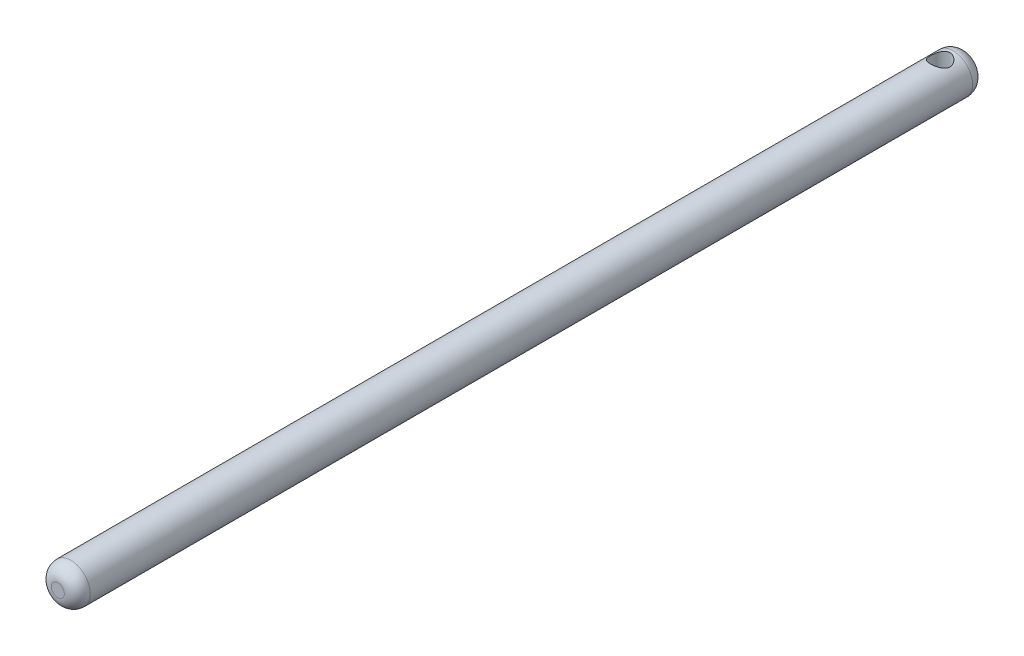
ISO-10303-21;
HEADER;
FILE_DESCRIPTION(('STEP AP214'),'2;1');
FILE_NAME('part.step','',(''),(''),'','','');
FILE_SCHEMA(('AUTOMOTIVE_DESIGN { 1 0 10303 214 1 1 1 1 }'));
ENDSEC;
DATA;
#1=APPLICATION_CONTEXT('core data for automotive mechanical design processes');
#2=APPLICATION_PROTOCOL_DEFINITION('international standard','automotive_design',2000,#1);
#3=PRODUCT_CONTEXT('',#1,'mechanical');
#4=PRODUCT('Part','Part','',(#3));
#5=PRODUCT_RELATED_PRODUCT_CATEGORY('part','',(#4));
#6=PRODUCT_DEFINITION_FORMATION('','',#4);
#7=PRODUCT_DEFINITION_CONTEXT('part definition',#1,'design');
#8=PRODUCT_DEFINITION('design','',#6,#7);
#9=PRODUCT_DEFINITION_SHAPE('','',#8);
#10=(LENGTH_UNIT() NAMED_UNIT(*) SI_UNIT(.MILLI.,.METRE.));
#11=(NAMED_UNIT(*) PLANE_ANGLE_UNIT() SI_UNIT($,.RADIAN.));
#12=(NAMED_UNIT(*) SI_UNIT($,.STERADIAN.) SOLID_ANGLE_UNIT());
#13=UNCERTAINTY_MEASURE_WITH_UNIT(LENGTH_MEASURE(1.E-05),#10,'distance_accuracy_value','');
#14=(GEOMETRIC_REPRESENTATION_CONTEXT(3) GLOBAL_UNCERTAINTY_ASSIGNED_CONTEXT((#13)) GLOBAL_UNIT_ASSIGNED_CONTEXT((#10,
#11,#12)) REPRESENTATION_CONTEXT('',''));
#15=CARTESIAN_POINT('',(0.,0.,0.));
#16=DIRECTION('',(0.,0.,1.));
#17=DIRECTION('',(1.,0.,0.));
#18=AXIS2_PLACEMENT_3D('',#15,#16,#17);
#19=CARTESIAN_POINT('',(0.,0.,55.5625));
#20=DIRECTION('',(0.,0.,-1.));
#21=DIRECTION('',(-1.,0.,0.));
#22=AXIS2_PLACEMENT_3D('',#19,#20,#21);
#23=CYLINDRICAL_SURFACE('',#22,2.38125);
#24=CARTESIAN_POINT('',(0.,0.,-53.975));
#25=DIRECTION('',(0.,0.,1.));
#26=DIRECTION('',(1.,0.,0.));
#27=AXIS2_PLACEMENT_3D('',#24,#25,#26);
#28=CIRCLE('',#27,2.38125);
#29=CARTESIAN_POINT('',(2.38125,0.,-53.975));
#30=VERTEX_POINT('',#29);
#31=EDGE_CURVE('E44',#30,#30,#28,.T.);
#32=ORIENTED_EDGE('',*,*,#31,.T.);
#33=EDGE_LOOP('',(#32));
#34=FACE_BOUND('',#33,.T.);
#35=CARTESIAN_POINT('',(0.,-2.38125,-51.196875));
#36=CARTESIAN_POINT('',(0.0625934933908994,-2.38124658771817,-51.1968789318242));
#37=CARTESIAN_POINT('',(0.125261607765469,-2.37875553370113,-51.2018399933105));
#38=CARTESIAN_POINT('',(0.248745655116467,-2.36903604532025,-51.2214648356559));
#39=CARTESIAN_POINT('',(0.309557840743264,-2.36179861446384,-51.2361470429128));
#40=CARTESIAN_POINT('',(0.427355251873432,-2.34334382664568,-51.2744963783844));
#41=CARTESIAN_POINT('',(0.484354349749458,-2.33214194770735,-51.2981285887453));
#42=CARTESIAN_POINT('',(0.593493959385313,-2.30678565164099,-51.3535262710626));
#43=CARTESIAN_POINT('',(0.6456348537819,-2.29263146732422,-51.3852911017463));
#44=CARTESIAN_POINT('',(0.747126495522779,-2.26166669988499,-51.4582377251684));
#45=CARTESIAN_POINT('',(0.796117610742257,-2.24474721461223,-51.4998729643447));
#46=CARTESIAN_POINT('',(0.886753026544736,-2.2105140207503,-51.5904021362285));
#47=CARTESIAN_POINT('',(0.928391728636486,-2.19320002298883,-51.6393015485166));
#48=CARTESIAN_POINT('',(1.00637816303611,-2.15859063769342,-51.7475192380263));
#49=CARTESIAN_POINT('',(1.04206516514116,-2.14140081986313,-51.8073514170931));
#50=CARTESIAN_POINT('',(1.10271904514173,-2.11081118475794,-51.9331186094086));
#51=CARTESIAN_POINT('',(1.12769358094428,-2.09740866244572,-51.9990492220105));
#52=CARTESIAN_POINT('',(1.16458893898078,-2.07713897941891,-52.131116891143));
#53=CARTESIAN_POINT('',(1.17720172358639,-2.06992860854359,-52.1970053007427));
#54=CARTESIAN_POINT('',(1.19113338890834,-2.06194687719966,-52.3303248037312));
#55=CARTESIAN_POINT('',(1.19246343021918,-2.06116915374353,-52.3977543064747));
#56=CARTESIAN_POINT('',(1.18429955128951,-2.06586451337537,-52.5235717977005));
#57=CARTESIAN_POINT('',(1.17608099119852,-2.07060121735085,-52.5820767371749));
#58=CARTESIAN_POINT('',(1.1512627577834,-2.08450134836241,-52.6967313983473));
#59=CARTESIAN_POINT('',(1.13466041470314,-2.09366618546584,-52.7528803636291));
#60=CARTESIAN_POINT('',(1.09324351977208,-2.1155915160392,-52.862832185961));
#61=CARTESIAN_POINT('',(1.06824668928498,-2.12843079040573,-52.9165499310543));
#62=CARTESIAN_POINT('',(1.01089025937971,-2.15626240722546,-53.019286454615));
#63=CARTESIAN_POINT('',(0.978527352789217,-2.17125571566414,-53.0683031083238));
#64=CARTESIAN_POINT('',(0.902572396630538,-2.204003536286,-53.1667893665474));
#65=CARTESIAN_POINT('',(0.858076839495926,-2.22186710625626,-53.2155283401016));
#66=CARTESIAN_POINT('',(0.761470860938948,-2.25680138992047,-53.3051568577598));
#67=CARTESIAN_POINT('',(0.709356821108757,-2.27387172175947,-53.3460426505153));
#68=CARTESIAN_POINT('',(0.595927464756042,-2.30626428608779,-53.4205882401635));
#69=CARTESIAN_POINT('',(0.534297244998043,-2.3214685301789,-53.4538243125057));
#70=CARTESIAN_POINT('',(0.405367587816347,-2.34741102209979,-53.5091842752043));
#71=CARTESIAN_POINT('',(0.338072701740843,-2.35815281492167,-53.5313169890337));
#72=CARTESIAN_POINT('',(0.205700104133522,-2.37320534860897,-53.5620222775502));
#73=CARTESIAN_POINT('',(0.140900384809098,-2.37797504664999,-53.571566127561));
#74=CARTESIAN_POINT('',(0.0104532111896987,-2.38211931649743,-53.579868945507));
#75=CARTESIAN_POINT('',(-0.0551938267826014,-2.38149644415062,-53.5786330225895));
#76=CARTESIAN_POINT('',(-0.180061757270823,-2.37519200776753,-53.5659726616014));
#77=CARTESIAN_POINT('',(-0.239386357709476,-2.36990626897501,-53.5553453282183));
#78=CARTESIAN_POINT('',(-0.355290706146968,-2.35532022721706,-53.5254540456499));
#79=CARTESIAN_POINT('',(-0.41187015077584,-2.34601948166815,-53.5061891443165));
#80=CARTESIAN_POINT('',(-0.522551749435379,-2.323912493394,-53.459064325903));
#81=CARTESIAN_POINT('',(-0.576536816435449,-2.31101362357334,-53.4309744059547));
#82=CARTESIAN_POINT('',(-0.679205558772774,-2.28295169421308,-53.3672563403714));
#83=CARTESIAN_POINT('',(-0.72788696232619,-2.26778767095513,-53.3316249834997));
#84=CARTESIAN_POINT('',(-0.823635905061679,-2.23490101029919,-53.249797743588));
#85=CARTESIAN_POINT('',(-0.870075505159957,-2.21707334772676,-53.2029080222475));
#86=CARTESIAN_POINT('',(-0.954710182325446,-2.18196785003363,-53.10196411677));
#87=CARTESIAN_POINT('',(-0.992899556088152,-2.1646904022613,-53.0479050179093));
#88=CARTESIAN_POINT('',(-1.06168973569881,-2.13182825744163,-52.9308492742177));
#89=CARTESIAN_POINT('',(-1.0918334810305,-2.11636605630572,-52.8675465861704));
#90=CARTESIAN_POINT('',(-1.14071736472268,-2.09042879913301,-52.7357458256536));
#91=CARTESIAN_POINT('',(-1.15947219672863,-2.07994732092736,-52.6672545762595));
#92=CARTESIAN_POINT('',(-1.18331657161977,-2.06646662138444,-52.5340537659056));
#93=CARTESIAN_POINT('',(-1.18954509883977,-2.06284572182648,-52.469612342011));
#94=CARTESIAN_POINT('',(-1.19144552443462,-2.06175000375602,-52.3405333356499));
#95=CARTESIAN_POINT('',(-1.18712199863717,-2.06427252119055,-52.2758958503446));
#96=CARTESIAN_POINT('',(-1.16910579328328,-2.07451954503311,-52.1547524559884));
#97=CARTESIAN_POINT('',(-1.15634489926439,-2.081725593681,-52.0980585027343));
#98=CARTESIAN_POINT('',(-1.12296816088621,-2.0999174114874,-51.98767845781));
#99=CARTESIAN_POINT('',(-1.10234978978714,-2.11090439637645,-51.9339933400718));
#100=CARTESIAN_POINT('',(-1.05229312174862,-2.13632093965267,-51.8271622867941));
#101=CARTESIAN_POINT('',(-1.02235532346271,-2.15093219477965,-51.774294904384));
#102=CARTESIAN_POINT('',(-0.95506100060486,-2.18164566727434,-51.67398875536));
#103=CARTESIAN_POINT('',(-0.917700616381009,-2.19774865799103,-51.6265528333514));
#104=CARTESIAN_POINT('',(-0.831298335810082,-2.23197328511557,-51.5324622022555));
#105=CARTESIAN_POINT('',(-0.781388641146478,-2.25010245755217,-51.4866027562503));
#106=CARTESIAN_POINT('',(-0.674078066156012,-2.28454448778714,-51.4037306353612));
#107=CARTESIAN_POINT('',(-0.6166731736276,-2.30085636405198,-51.3667227289956));
#108=CARTESIAN_POINT('',(-0.495218557463739,-2.33002942662264,-51.3025592055863));
#109=CARTESIAN_POINT('',(-0.431124721872141,-2.34286539970214,-51.2754750982945));
#110=CARTESIAN_POINT('',(-0.298539814353391,-2.36340659560876,-51.2328221500715));
#111=CARTESIAN_POINT('',(-0.230061848926329,-2.37112639390897,-51.2172205823685));
#112=CARTESIAN_POINT('',(-0.134066692531778,-2.37762409336193,-51.2041408949378));
#113=CARTESIAN_POINT('',(-0.107348987707652,-2.37898025606987,-51.2014200432218));
#114=CARTESIAN_POINT('',(-0.0537587806828962,-2.3807939546427,-51.1977862263691));
#115=CARTESIAN_POINT('',(-0.0268862742301627,-2.38125146570418,-51.1968733111327));
#116=CARTESIAN_POINT('',(0.,-2.38125,-51.196875));
#117=B_SPLINE_CURVE_WITH_KNOTS('',3,(#35,#36,#37,#38,#39,#40,#41,#42,#43,#44,#45,#46,#47,#48,
#49,#50,#51,#52,#53,#54,#55,#56,#57,#58,#59,#60,#61,#62,#63,#64,#65,#66,#67,#68,#69,#70,#71,#72,
#73,#74,#75,#76,#77,#78,#79,#80,#81,#82,#83,#84,#85,#86,#87,#88,#89,#90,#91,#92,#93,#94,#95,#96,
#97,#98,#99,#100,#101,#102,#103,#104,#105,#106,#107,#108,#109,#110,#111,#112,#113,#114,#115,
#116),.UNSPECIFIED.,.T.,.F.,(4,2,2,2,2,2,2,2,2,2,2,2,2,2,2,2,2,2,2,2,2,2,2,2,2,2,2,2,2,2,2,2,2,
2,2,2,2,2,2,2,4),(0.,0.187671381491034,0.37569951574751,0.563001503883015,0.750288727442423,
0.948906406473715,1.14767467670682,1.36185743031614,1.5758868171639,1.7771032070446,
1.97812053569864,2.15509926337345,2.33213438424009,2.51329317200603,2.69453345625449,
2.89875445775647,3.10307277131559,3.31687910824066,3.53051527011181,3.72645730217444,
3.92230647121474,4.10297598058849,4.28366541066825,4.46952119208214,4.65545627297239,
4.85965036423508,5.06398516445245,5.27821543446359,5.49216872029484,5.68558331740248,
5.87891405645815,6.05382723196975,6.22879670208062,6.41552156348462,6.60234377481067,
6.81186617152189,7.02150118957728,7.23261841267416,7.44313156831553,7.52374130413941,
7.60435326481735),.UNSPECIFIED.);
#118=CARTESIAN_POINT('',(0.,-2.38125,-51.196875));
#119=VERTEX_POINT('',#118);
#120=EDGE_CURVE('E48',#119,#119,#117,.T.);
#121=ORIENTED_EDGE('',*,*,#120,.T.);
#122=EDGE_LOOP('',(#121));
#123=FACE_BOUND('',#122,.T.);
#124=CARTESIAN_POINT('',(0.,2.38125,-51.196875));
#125=CARTESIAN_POINT('',(-0.0625934933908988,2.38124658771817,-51.1968789318242));
#126=CARTESIAN_POINT('',(-0.125261607765469,2.37875553370113,-51.2018399933105));
#127=CARTESIAN_POINT('',(-0.248745655116467,2.36903604532025,-51.2214648356559));
#128=CARTESIAN_POINT('',(-0.309557840743263,2.36179861446383,-51.2361470429128));
#129=CARTESIAN_POINT('',(-0.427355251873431,2.34334382664568,-51.2744963783844));
#130=CARTESIAN_POINT('',(-0.484354349749458,2.33214194770735,-51.2981285887453));
#131=CARTESIAN_POINT('',(-0.593493959385312,2.30678565164099,-51.3535262710626));
#132=CARTESIAN_POINT('',(-0.645634853781898,2.29263146732422,-51.3852911017463));
#133=CARTESIAN_POINT('',(-0.747126495522779,2.26166669988499,-51.4582377251684));
#134=CARTESIAN_POINT('',(-0.796117610742258,2.24474721461223,-51.4998729643447));
#135=CARTESIAN_POINT('',(-0.886753026544737,2.2105140207503,-51.5904021362285));
#136=CARTESIAN_POINT('',(-0.928391728636486,2.19320002298883,-51.6393015485166));
#137=CARTESIAN_POINT('',(-1.0063781630361,2.15859063769342,-51.7475192380263));
#138=CARTESIAN_POINT('',(-1.04206516514116,2.14140081986313,-51.8073514170931));
#139=CARTESIAN_POINT('',(-1.10271904514173,2.11081118475795,-51.9331186094086));
#140=CARTESIAN_POINT('',(-1.12769358094428,2.09740866244572,-51.9990492220105));
#141=CARTESIAN_POINT('',(-1.16458893898078,2.07713897941891,-52.131116891143));
#142=CARTESIAN_POINT('',(-1.17720172358639,2.06992860854359,-52.1970053007427));
#143=CARTESIAN_POINT('',(-1.19113338890834,2.06194687719966,-52.3303248037312));
#144=CARTESIAN_POINT('',(-1.19246343021918,2.06116915374353,-52.3977543064747));
#145=CARTESIAN_POINT('',(-1.18429955128951,2.06586451337537,-52.5235717977005));
#146=CARTESIAN_POINT('',(-1.17608099119852,2.07060121735085,-52.5820767371749));
#147=CARTESIAN_POINT('',(-1.1512627577834,2.08450134836241,-52.6967313983473));
#148=CARTESIAN_POINT('',(-1.13466041470314,2.09366618546584,-52.7528803636291));
#149=CARTESIAN_POINT('',(-1.09324351977208,2.1155915160392,-52.862832185961));
#150=CARTESIAN_POINT('',(-1.06824668928498,2.12843079040573,-52.9165499310543));
#151=CARTESIAN_POINT('',(-1.01089025937971,2.15626240722546,-53.019286454615));
#152=CARTESIAN_POINT('',(-0.978527352789213,2.17125571566415,-53.0683031083238));
#153=CARTESIAN_POINT('',(-0.902572396630532,2.204003536286,-53.1667893665474));
#154=CARTESIAN_POINT('',(-0.858076839495922,2.22186710625626,-53.2155283401016));
#155=CARTESIAN_POINT('',(-0.761470860938945,2.25680138992047,-53.3051568577598));
#156=CARTESIAN_POINT('',(-0.709356821108756,2.27387172175947,-53.3460426505153));
#157=CARTESIAN_POINT('',(-0.595927464756041,2.30626428608779,-53.4205882401635));
#158=CARTESIAN_POINT('',(-0.534297244998042,2.3214685301789,-53.4538243125057));
#159=CARTESIAN_POINT('',(-0.405367587816345,2.34741102209979,-53.5091842752043));
#160=CARTESIAN_POINT('',(-0.338072701740842,2.35815281492167,-53.5313169890337));
#161=CARTESIAN_POINT('',(-0.205700104133521,2.37320534860897,-53.5620222775502));
#162=CARTESIAN_POINT('',(-0.140900384809097,2.37797504664999,-53.571566127561));
#163=CARTESIAN_POINT('',(-0.0104532111896979,2.38211931649743,-53.579868945507));
#164=CARTESIAN_POINT('',(0.0551938267826021,2.38149644415062,-53.5786330225895));
#165=CARTESIAN_POINT('',(0.180061757270824,2.37519200776753,-53.5659726616014));
#166=CARTESIAN_POINT('',(0.239386357709476,2.36990626897501,-53.5553453282183));
#167=CARTESIAN_POINT('',(0.355290706146968,2.35532022721706,-53.5254540456499));
#168=CARTESIAN_POINT('',(0.411870150775841,2.34601948166815,-53.5061891443165));
#169=CARTESIAN_POINT('',(0.52255174943538,2.323912493394,-53.459064325903));
#170=CARTESIAN_POINT('',(0.576536816435449,2.31101362357334,-53.4309744059547));
#171=CARTESIAN_POINT('',(0.679205558772775,2.28295169421308,-53.3672563403714));
#172=CARTESIAN_POINT('',(0.727886962326192,2.26778767095513,-53.3316249834997));
#173=CARTESIAN_POINT('',(0.823635905061678,2.23490101029919,-53.249797743588));
#174=CARTESIAN_POINT('',(0.870075505159953,2.21707334772676,-53.2029080222475));
#175=CARTESIAN_POINT('',(0.954710182325443,2.18196785003363,-53.10196411677));
#176=CARTESIAN_POINT('',(0.992899556088151,2.1646904022613,-53.0479050179093));
#177=CARTESIAN_POINT('',(1.06168973569881,2.13182825744163,-52.9308492742177));
#178=CARTESIAN_POINT('',(1.0918334810305,2.11636605630572,-52.8675465861704));
#179=CARTESIAN_POINT('',(1.14071736472268,2.09042879913301,-52.7357458256536));
#180=CARTESIAN_POINT('',(1.15947219672863,2.07994732092736,-52.6672545762595));
#181=CARTESIAN_POINT('',(1.18331657161977,2.06646662138444,-52.5340537659056));
#182=CARTESIAN_POINT('',(1.18954509883977,2.06284572182648,-52.469612342011));
#183=CARTESIAN_POINT('',(1.19144552443462,2.06175000375602,-52.3405333356499));
#184=CARTESIAN_POINT('',(1.18712199863717,2.06427252119055,-52.2758958503446));
#185=CARTESIAN_POINT('',(1.16910579328328,2.07451954503311,-52.1547524559884));
#186=CARTESIAN_POINT('',(1.15634489926439,2.081725593681,-52.0980585027343));
#187=CARTESIAN_POINT('',(1.12296816088621,2.09991741148739,-51.98767845781));
#188=CARTESIAN_POINT('',(1.10234978978715,2.11090439637645,-51.9339933400718));
#189=CARTESIAN_POINT('',(1.05229312174862,2.13632093965266,-51.8271622867941));
#190=CARTESIAN_POINT('',(1.02235532346271,2.15093219477965,-51.774294904384));
#191=CARTESIAN_POINT('',(0.955061000604861,2.18164566727434,-51.67398875536));
#192=CARTESIAN_POINT('',(0.91770061638101,2.19774865799103,-51.6265528333514));
#193=CARTESIAN_POINT('',(0.831298335810083,2.23197328511557,-51.5324622022555));
#194=CARTESIAN_POINT('',(0.781388641146479,2.25010245755217,-51.4866027562503));
#195=CARTESIAN_POINT('',(0.674078066156013,2.28454448778714,-51.4037306353612));
#196=CARTESIAN_POINT('',(0.616673173627601,2.30085636405198,-51.3667227289956));
#197=CARTESIAN_POINT('',(0.495218557463741,2.33002942662264,-51.3025592055863));
#198=CARTESIAN_POINT('',(0.431124721872143,2.34286539970214,-51.2754750982945));
#199=CARTESIAN_POINT('',(0.298539814353393,2.36340659560876,-51.2328221500715));
#200=CARTESIAN_POINT('',(0.230061848926331,2.37112639390897,-51.2172205823685));
#201=CARTESIAN_POINT('',(0.134066692531779,2.37762409336193,-51.2041408949378));
#202=CARTESIAN_POINT('',(0.107348987707653,2.37898025606987,-51.2014200432218));
#203=CARTESIAN_POINT('',(0.0537587806828971,2.3807939546427,-51.1977862263691));
#204=CARTESIAN_POINT('',(0.0268862742301635,2.38125146570418,-51.1968733111327));
#205=CARTESIAN_POINT('',(0.,2.38125,-51.196875));
#206=B_SPLINE_CURVE_WITH_KNOTS('',3,(#124,#125,#126,#127,#128,#129,#130,#131,#132,#133,#134,
#135,#136,#137,#138,#139,#140,#141,#142,#143,#144,#145,#146,#147,#148,#149,#150,#151,#152,#153,
#154,#155,#156,#157,#158,#159,#160,#161,#162,#163,#164,#165,#166,#167,#168,#169,#170,#171,#172,
#173,#174,#175,#176,#177,#178,#179,#180,#181,#182,#183,#184,#185,#186,#187,#188,#189,#190,#191,
#192,#193,#194,#195,#196,#197,#198,#199,#200,#201,#202,#203,#204,#205),.UNSPECIFIED.,.T.,.F.,(4,
2,2,2,2,2,2,2,2,2,2,2,2,2,2,2,2,2,2,2,2,2,2,2,2,2,2,2,2,2,2,2,2,2,2,2,2,2,2,2,4),(0.,
0.187671381491034,0.37569951574751,0.563001503883015,0.750288727442422,0.948906406473717,
1.14767467670682,1.36185743031614,1.5758868171639,1.77710320704459,1.97812053569864,
2.15509926337345,2.33213438424009,2.51329317200603,2.6945334562545,2.89875445775647,
3.10307277131559,3.31687910824066,3.53051527011181,3.72645730217444,3.92230647121474,
4.10297598058849,4.28366541066825,4.46952119208214,4.65545627297238,4.85965036423508,
5.06398516445245,5.27821543446359,5.49216872029485,5.68558331740248,5.87891405645815,
6.05382723196975,6.22879670208063,6.41552156348462,6.60234377481068,6.8118661715219,
7.02150118957728,7.23261841267416,7.44313156831553,7.52374130413942,7.60435326481735),.UNSPECIFIED.);
#207=CARTESIAN_POINT('',(0.,2.38125,-51.196875));
#208=VERTEX_POINT('',#207);
#209=EDGE_CURVE('E52',#208,#208,#206,.T.);
#210=ORIENTED_EDGE('',*,*,#209,.T.);
#211=EDGE_LOOP('',(#210));
#212=FACE_BOUND('',#211,.T.);
#213=CARTESIAN_POINT('',(0.,0.,53.975));
#214=DIRECTION('',(0.,0.,1.));
#215=DIRECTION('',(1.,0.,0.));
#216=AXIS2_PLACEMENT_3D('',#213,#214,#215);
#217=CIRCLE('',#216,2.38125);
#218=CARTESIAN_POINT('',(2.38125,0.,53.975));
#219=VERTEX_POINT('',#218);
#220=EDGE_CURVE('E93',#219,#219,#217,.F.);
#221=ORIENTED_EDGE('',*,*,#220,.T.);
#222=EDGE_LOOP('',(#221));
#223=FACE_BOUND('',#222,.T.);
#224=ADVANCED_FACE('F37',(#34,#123,#212,#223),#23,.T.);
#225=CARTESIAN_POINT('',(0.,0.,55.5625));
#226=DIRECTION('',(0.,0.,1.));
#227=DIRECTION('',(1.,0.,0.));
#228=AXIS2_PLACEMENT_3D('',#225,#226,#227);
#229=PLANE('',#228);
#230=CARTESIAN_POINT('',(0.,0.,55.5625));
#231=DIRECTION('',(0.,0.,1.));
#232=DIRECTION('',(1.,0.,0.));
#233=AXIS2_PLACEMENT_3D('',#230,#231,#232);
#234=CIRCLE('',#233,0.79375);
#235=CARTESIAN_POINT('',(0.79375,0.,55.5625));
#236=VERTEX_POINT('',#235);
#237=EDGE_CURVE('E94',#236,#236,#234,.T.);
#238=ORIENTED_EDGE('',*,*,#237,.T.);
#239=EDGE_LOOP('',(#238));
#240=FACE_BOUND('',#239,.T.);
#241=ADVANCED_FACE('F72',(#240),#229,.T.);
#242=CARTESIAN_POINT('',(0.,0.,-55.5625));
#243=DIRECTION('',(0.,0.,1.));
#244=DIRECTION('',(1.,0.,0.));
#245=AXIS2_PLACEMENT_3D('',#242,#243,#244);
#246=PLANE('',#245);
#247=CARTESIAN_POINT('',(0.,0.,-55.5625));
#248=DIRECTION('',(0.,0.,1.));
#249=DIRECTION('',(1.,0.,0.));
#250=AXIS2_PLACEMENT_3D('',#247,#248,#249);
#251=CIRCLE('',#250,0.79375);
#252=CARTESIAN_POINT('',(0.79375,0.,-55.5625));
#253=VERTEX_POINT('',#252);
#254=EDGE_CURVE('E10',#253,#253,#251,.F.);
#255=ORIENTED_EDGE('',*,*,#254,.T.);
#256=EDGE_LOOP('',(#255));
#257=FACE_BOUND('',#256,.T.);
#258=ADVANCED_FACE('F75',(#257),#246,.F.);
#259=CARTESIAN_POINT('',(0.,0.,53.975));
#260=DIRECTION('',(0.,0.,1.));
#261=DIRECTION('',(1.,0.,0.));
#262=AXIS2_PLACEMENT_3D('',#259,#260,#261);
#263=DEGENERATE_TOROIDAL_SURFACE('',#262,0.79375,1.5875,.T.);
#264=ORIENTED_EDGE('',*,*,#220,.F.);
#265=EDGE_LOOP('',(#264));
#266=FACE_BOUND('',#265,.T.);
#267=ORIENTED_EDGE('',*,*,#237,.F.);
#268=EDGE_LOOP('',(#267));
#269=FACE_BOUND('',#268,.T.);
#270=ADVANCED_FACE('F70',(#266,#269),#263,.T.);
#271=CARTESIAN_POINT('',(0.,2.38125,-52.3875));
#272=DIRECTION('',(0.,1.,0.));
#273=DIRECTION('',(0.,0.,1.));
#274=AXIS2_PLACEMENT_3D('',#271,#272,#273);
#275=CYLINDRICAL_SURFACE('',#274,1.19062499999999);
#276=ORIENTED_EDGE('',*,*,#209,.F.);
#277=EDGE_LOOP('',(#276));
#278=FACE_BOUND('',#277,.T.);
#279=ORIENTED_EDGE('',*,*,#120,.F.);
#280=EDGE_LOOP('',(#279));
#281=FACE_BOUND('',#280,.T.);
#282=ADVANCED_FACE('F66',(#278,#281),#275,.F.);
#283=CARTESIAN_POINT('',(0.,0.,-53.975));
#284=DIRECTION('',(0.,0.,1.));
#285=DIRECTION('',(1.,0.,0.));
#286=AXIS2_PLACEMENT_3D('',#283,#284,#285);
#287=DEGENERATE_TOROIDAL_SURFACE('',#286,0.79375,1.5875,.T.);
#288=ORIENTED_EDGE('',*,*,#254,.F.);
#289=EDGE_LOOP('',(#288));
#290=FACE_BOUND('',#289,.T.);
#291=ORIENTED_EDGE('',*,*,#31,.F.);
#292=EDGE_LOOP('',(#291));
#293=FACE_BOUND('',#292,.T.);
#294=ADVANCED_FACE('F39',(#290,#293),#287,.T.);
#295=CLOSED_SHELL('',(#224,#241,#258,#270,#282,#294));
#296=MANIFOLD_SOLID_BREP('B2',#295);
#297=ADVANCED_BREP_SHAPE_REPRESENTATION('',(#18,#296),#14);
#298=SHAPE_DEFINITION_REPRESENTATION(#9,#297);
ENDSEC;
END-ISO-10303-21;
